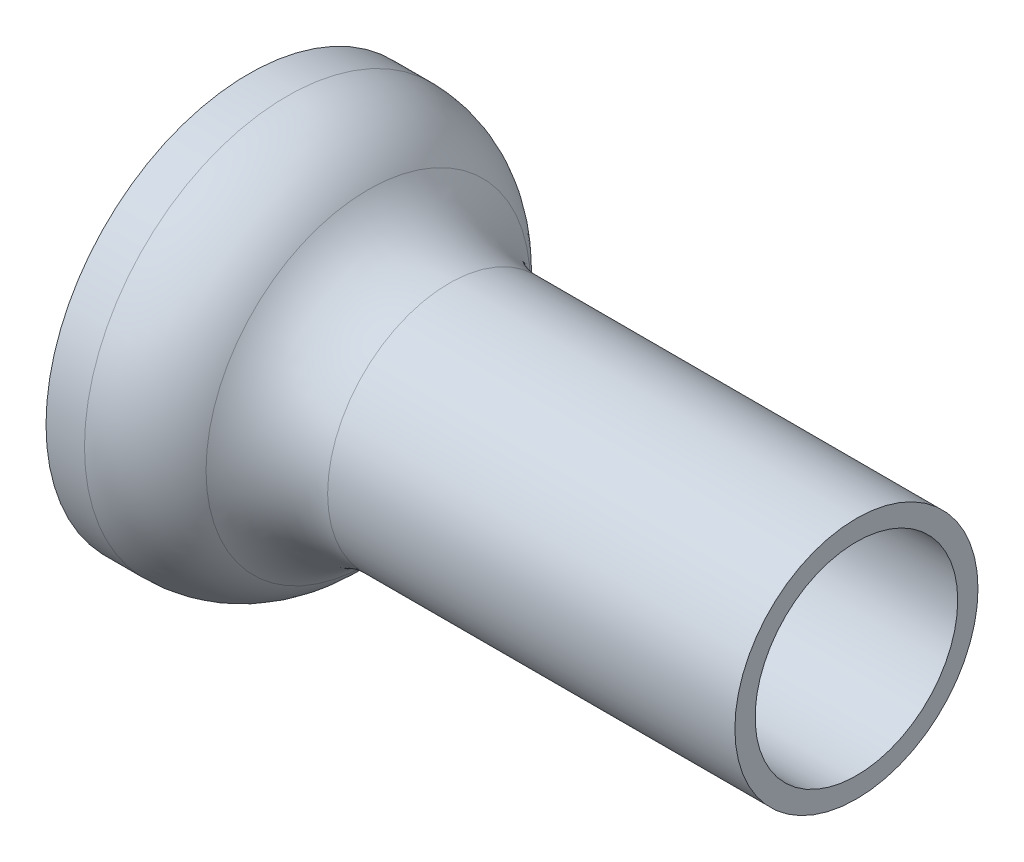
ISO-10303-21;
HEADER;
FILE_DESCRIPTION(('STEP AP214'),'2;1');
FILE_NAME('part.step','',(''),(''),'','','');
FILE_SCHEMA(('AUTOMOTIVE_DESIGN { 1 0 10303 214 1 1 1 1 }'));
ENDSEC;
DATA;
#1=APPLICATION_CONTEXT('core data for automotive mechanical design processes');
#2=APPLICATION_PROTOCOL_DEFINITION('international standard','automotive_design',2000,#1);
#3=PRODUCT_CONTEXT('',#1,'mechanical');
#4=PRODUCT('Part','Part','',(#3));
#5=PRODUCT_RELATED_PRODUCT_CATEGORY('part','',(#4));
#6=PRODUCT_DEFINITION_FORMATION('','',#4);
#7=PRODUCT_DEFINITION_CONTEXT('part definition',#1,'design');
#8=PRODUCT_DEFINITION('design','',#6,#7);
#9=PRODUCT_DEFINITION_SHAPE('','',#8);
#10=(LENGTH_UNIT() NAMED_UNIT(*) SI_UNIT(.MILLI.,.METRE.));
#11=(NAMED_UNIT(*) PLANE_ANGLE_UNIT() SI_UNIT($,.RADIAN.));
#12=(NAMED_UNIT(*) SI_UNIT($,.STERADIAN.) SOLID_ANGLE_UNIT());
#13=UNCERTAINTY_MEASURE_WITH_UNIT(LENGTH_MEASURE(1.E-05),#10,'distance_accuracy_value','');
#14=(GEOMETRIC_REPRESENTATION_CONTEXT(3) GLOBAL_UNCERTAINTY_ASSIGNED_CONTEXT((#13)) GLOBAL_UNIT_ASSIGNED_CONTEXT((#10,
#11,#12)) REPRESENTATION_CONTEXT('',''));
#15=CARTESIAN_POINT('',(0.,0.,0.));
#16=DIRECTION('',(0.,0.,1.));
#17=DIRECTION('',(1.,0.,0.));
#18=AXIS2_PLACEMENT_3D('',#15,#16,#17);
#19=CARTESIAN_POINT('',(15.,0.,0.));
#20=DIRECTION('',(1.,0.,0.));
#21=DIRECTION('',(0.,0.,-1.));
#22=AXIS2_PLACEMENT_3D('',#19,#20,#21);
#23=PLANE('',#22);
#24=CARTESIAN_POINT('',(15.,0.,0.));
#25=DIRECTION('',(1.,0.,0.));
#26=DIRECTION('',(0.,0.,-1.));
#27=AXIS2_PLACEMENT_3D('',#24,#25,#26);
#28=CIRCLE('',#27,3.);
#29=CARTESIAN_POINT('',(15.,0.,-3.));
#30=VERTEX_POINT('',#29);
#31=EDGE_CURVE('E46',#30,#30,#28,.T.);
#32=ORIENTED_EDGE('',*,*,#31,.T.);
#33=EDGE_LOOP('',(#32));
#34=FACE_BOUND('',#33,.T.);
#35=CARTESIAN_POINT('',(15.,0.,0.));
#36=DIRECTION('',(1.,0.,0.));
#37=DIRECTION('',(0.,0.,-1.));
#38=AXIS2_PLACEMENT_3D('',#35,#36,#37);
#39=CIRCLE('',#38,2.5);
#40=CARTESIAN_POINT('',(15.,0.,-2.5));
#41=VERTEX_POINT('',#40);
#42=EDGE_CURVE('E51',#41,#41,#39,.T.);
#43=ORIENTED_EDGE('',*,*,#42,.F.);
#44=EDGE_LOOP('',(#43));
#45=FACE_BOUND('',#44,.T.);
#46=ADVANCED_FACE('F31',(#34,#45),#23,.T.);
#47=CARTESIAN_POINT('',(0.,0.,0.));
#48=DIRECTION('',(1.,0.,0.));
#49=DIRECTION('',(0.,0.,-1.));
#50=AXIS2_PLACEMENT_3D('',#47,#48,#49);
#51=PLANE('',#50);
#52=CARTESIAN_POINT('',(0.,0.,0.));
#53=DIRECTION('',(1.,0.,0.));
#54=DIRECTION('',(0.,0.,-1.));
#55=AXIS2_PLACEMENT_3D('',#52,#53,#54);
#56=CIRCLE('',#55,2.5);
#57=CARTESIAN_POINT('',(0.,0.,-2.5));
#58=VERTEX_POINT('',#57);
#59=EDGE_CURVE('E52',#58,#58,#56,.T.);
#60=ORIENTED_EDGE('',*,*,#59,.T.);
#61=EDGE_LOOP('',(#60));
#62=FACE_BOUND('',#61,.T.);
#63=CARTESIAN_POINT('',(0.,0.,0.));
#64=DIRECTION('',(1.,0.,0.));
#65=DIRECTION('',(0.,0.,-1.));
#66=AXIS2_PLACEMENT_3D('',#63,#64,#65);
#67=CIRCLE('',#66,5.);
#68=CARTESIAN_POINT('',(0.,0.,-5.));
#69=VERTEX_POINT('',#68);
#70=EDGE_CURVE('E55',#69,#69,#67,.T.);
#71=ORIENTED_EDGE('',*,*,#70,.F.);
#72=EDGE_LOOP('',(#71));
#73=FACE_BOUND('',#72,.T.);
#74=ADVANCED_FACE('F63',(#62,#73),#51,.F.);
#75=CARTESIAN_POINT('',(15.,0.,0.));
#76=DIRECTION('',(-1.,0.,0.));
#77=DIRECTION('',(0.,0.,1.));
#78=AXIS2_PLACEMENT_3D('',#75,#76,#77);
#79=CYLINDRICAL_SURFACE('',#78,3.);
#80=CARTESIAN_POINT('',(4.94948974278318,0.,0.));
#81=DIRECTION('',(-1.,0.,0.));
#82=DIRECTION('',(0.,0.,1.));
#83=AXIS2_PLACEMENT_3D('',#80,#81,#82);
#84=CIRCLE('',#83,3.);
#85=CARTESIAN_POINT('',(4.94948974278318,0.,3.));
#86=VERTEX_POINT('',#85);
#87=EDGE_CURVE('E42',#86,#86,#84,.F.);
#88=ORIENTED_EDGE('',*,*,#87,.T.);
#89=EDGE_LOOP('',(#88));
#90=FACE_BOUND('',#89,.T.);
#91=ORIENTED_EDGE('',*,*,#31,.F.);
#92=EDGE_LOOP('',(#91));
#93=FACE_BOUND('',#92,.T.);
#94=ADVANCED_FACE('F65',(#90,#93),#79,.T.);
#95=CARTESIAN_POINT('',(15.,0.,0.));
#96=DIRECTION('',(-1.,0.,0.));
#97=DIRECTION('',(0.,0.,1.));
#98=AXIS2_PLACEMENT_3D('',#95,#96,#97);
#99=CYLINDRICAL_SURFACE('',#98,2.5);
#100=ORIENTED_EDGE('',*,*,#42,.T.);
#101=EDGE_LOOP('',(#100));
#102=FACE_BOUND('',#101,.T.);
#103=ORIENTED_EDGE('',*,*,#59,.F.);
#104=EDGE_LOOP('',(#103));
#105=FACE_BOUND('',#104,.T.);
#106=ADVANCED_FACE('F72',(#102,#105),#99,.F.);
#107=CARTESIAN_POINT('',(2.5,0.,0.));
#108=DIRECTION('',(-1.,0.,0.));
#109=DIRECTION('',(0.,0.,1.));
#110=AXIS2_PLACEMENT_3D('',#107,#108,#109);
#111=CYLINDRICAL_SURFACE('',#110,5.);
#112=CARTESIAN_POINT('',(0.949489742783178,0.,0.));
#113=DIRECTION('',(-1.,0.,0.));
#114=DIRECTION('',(0.,0.,1.));
#115=AXIS2_PLACEMENT_3D('',#112,#113,#114);
#116=CIRCLE('',#115,5.);
#117=CARTESIAN_POINT('',(0.949489742783178,0.,5.));
#118=VERTEX_POINT('',#117);
#119=EDGE_CURVE('E10',#118,#118,#116,.T.);
#120=ORIENTED_EDGE('',*,*,#119,.T.);
#121=EDGE_LOOP('',(#120));
#122=FACE_BOUND('',#121,.T.);
#123=ORIENTED_EDGE('',*,*,#70,.T.);
#124=EDGE_LOOP('',(#123));
#125=FACE_BOUND('',#124,.T.);
#126=ADVANCED_FACE('F61',(#122,#125),#111,.T.);
#127=CARTESIAN_POINT('',(4.94948974278318,0.,0.));
#128=DIRECTION('',(-1.,0.,0.));
#129=DIRECTION('',(0.,0.,1.));
#130=AXIS2_PLACEMENT_3D('',#127,#128,#129);
#131=TOROIDAL_SURFACE('',#130,5.5,2.5);
#132=CARTESIAN_POINT('',(2.94948974278318,0.,0.));
#133=DIRECTION('',(1.,0.,0.));
#134=DIRECTION('',(0.,0.,-1.));
#135=AXIS2_PLACEMENT_3D('',#132,#133,#134);
#136=CIRCLE('',#135,4.);
#137=CARTESIAN_POINT('',(2.94948974278318,0.,-4.));
#138=VERTEX_POINT('',#137);
#139=EDGE_CURVE('E38',#138,#138,#136,.T.);
#140=ORIENTED_EDGE('',*,*,#139,.T.);
#141=EDGE_LOOP('',(#140));
#142=FACE_BOUND('',#141,.T.);
#143=ORIENTED_EDGE('',*,*,#87,.F.);
#144=EDGE_LOOP('',(#143));
#145=FACE_BOUND('',#144,.T.);
#146=ADVANCED_FACE('F78',(#142,#145),#131,.F.);
#147=CARTESIAN_POINT('',(0.949489742783178,0.,0.));
#148=DIRECTION('',(-1.,0.,0.));
#149=DIRECTION('',(0.,0.,1.));
#150=AXIS2_PLACEMENT_3D('',#147,#148,#149);
#151=TOROIDAL_SURFACE('',#150,2.5,2.5);
#152=ORIENTED_EDGE('',*,*,#119,.F.);
#153=EDGE_LOOP('',(#152));
#154=FACE_BOUND('',#153,.T.);
#155=ORIENTED_EDGE('',*,*,#139,.F.);
#156=EDGE_LOOP('',(#155));
#157=FACE_BOUND('',#156,.T.);
#158=ADVANCED_FACE('F33',(#154,#157),#151,.T.);
#159=CLOSED_SHELL('',(#46,#74,#94,#106,#126,#146,#158));
#160=MANIFOLD_SOLID_BREP('B2',#159);
#161=ADVANCED_BREP_SHAPE_REPRESENTATION('',(#18,#160),#14);
#162=SHAPE_DEFINITION_REPRESENTATION(#9,#161);
ENDSEC;
END-ISO-10303-21;
